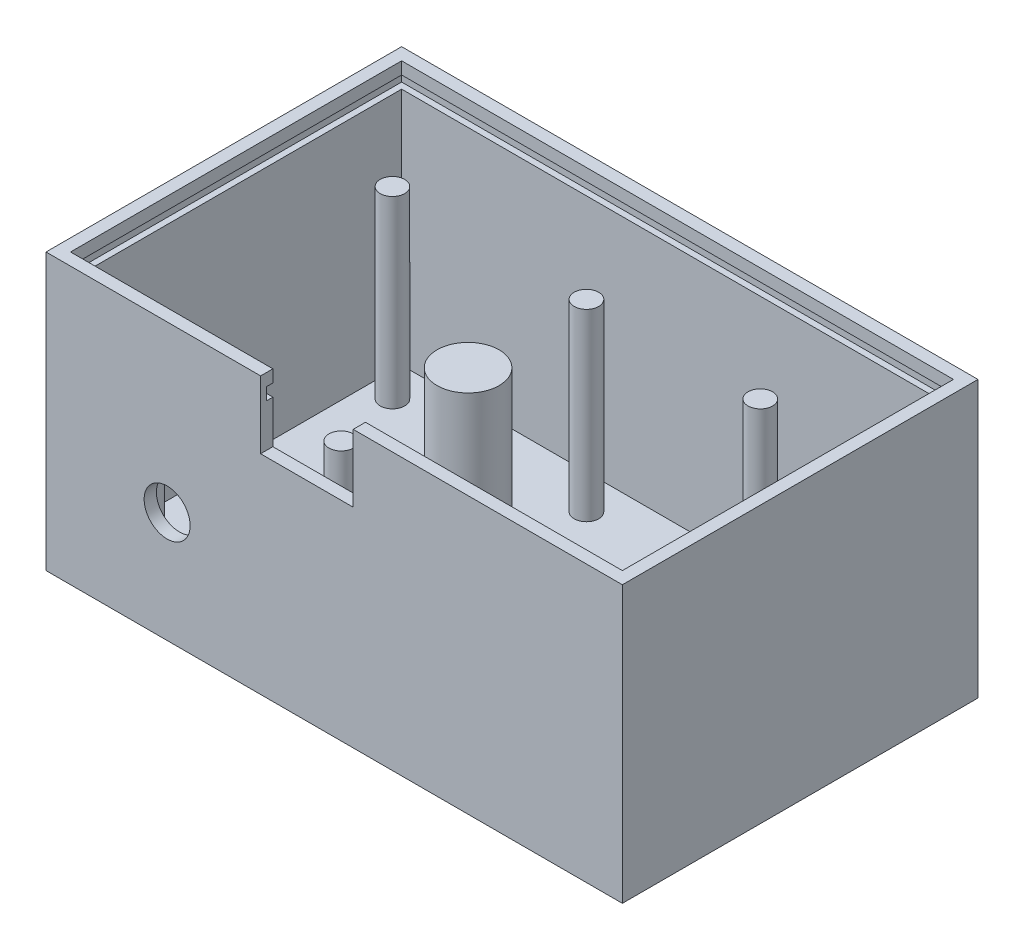
ISO-10303-21;
HEADER;
FILE_DESCRIPTION(('STEP AP214'),'2;1');
FILE_NAME('part.step','',(''),(''),'','','');
FILE_SCHEMA(('AUTOMOTIVE_DESIGN { 1 0 10303 214 1 1 1 1 }'));
ENDSEC;
DATA;
#1=APPLICATION_CONTEXT('core data for automotive mechanical design processes');
#2=APPLICATION_PROTOCOL_DEFINITION('international standard','automotive_design',2000,#1);
#3=PRODUCT_CONTEXT('',#1,'mechanical');
#4=PRODUCT('Part','Part','',(#3));
#5=PRODUCT_RELATED_PRODUCT_CATEGORY('part','',(#4));
#6=PRODUCT_DEFINITION_FORMATION('','',#4);
#7=PRODUCT_DEFINITION_CONTEXT('part definition',#1,'design');
#8=PRODUCT_DEFINITION('design','',#6,#7);
#9=PRODUCT_DEFINITION_SHAPE('','',#8);
#10=(LENGTH_UNIT() NAMED_UNIT(*) SI_UNIT(.MILLI.,.METRE.));
#11=(NAMED_UNIT(*) PLANE_ANGLE_UNIT() SI_UNIT($,.RADIAN.));
#12=(NAMED_UNIT(*) SI_UNIT($,.STERADIAN.) SOLID_ANGLE_UNIT());
#13=UNCERTAINTY_MEASURE_WITH_UNIT(LENGTH_MEASURE(1.E-05),#10,'distance_accuracy_value','');
#14=(GEOMETRIC_REPRESENTATION_CONTEXT(3) GLOBAL_UNCERTAINTY_ASSIGNED_CONTEXT((#13)) GLOBAL_UNIT_ASSIGNED_CONTEXT((#10,
#11,#12)) REPRESENTATION_CONTEXT('',''));
#15=CARTESIAN_POINT('',(0.,0.,0.));
#16=DIRECTION('',(0.,0.,1.));
#17=DIRECTION('',(1.,0.,0.));
#18=AXIS2_PLACEMENT_3D('',#15,#16,#17);
#19=CARTESIAN_POINT('',(2.,2.,-2.00000000000001));
#20=DIRECTION('',(0.,0.,1.));
#21=DIRECTION('',(1.,0.,0.));
#22=AXIS2_PLACEMENT_3D('',#19,#20,#21);
#23=PLANE('',#22);
#24=DIRECTION('',(1.,0.,0.));
#25=VECTOR('',#24,1.);
#26=CARTESIAN_POINT('',(2.,45.,-2.00000000000001));
#27=LINE('',#26,#25);
#28=CARTESIAN_POINT('',(2.,45.,-2.00000000000001));
#29=VERTEX_POINT('',#28);
#30=CARTESIAN_POINT('',(35.,45.,-2.00000000000002));
#31=VERTEX_POINT('',#30);
#32=EDGE_CURVE('E343',#29,#31,#27,.T.);
#33=ORIENTED_EDGE('',*,*,#32,.T.);
#34=DIRECTION('',(0.,1.,0.));
#35=VECTOR('',#34,1.);
#36=CARTESIAN_POINT('',(35.,34.,-2.00000000000002));
#37=LINE('',#36,#35);
#38=CARTESIAN_POINT('',(35.,43.,-2.00000000000002));
#39=VERTEX_POINT('',#38);
#40=EDGE_CURVE('E226',#39,#31,#37,.T.);
#41=ORIENTED_EDGE('',*,*,#40,.F.);
#42=DIRECTION('',(1.,0.,0.));
#43=VECTOR('',#42,1.);
#44=CARTESIAN_POINT('',(2.,43.,-2.00000000000001));
#45=LINE('',#44,#43);
#46=CARTESIAN_POINT('',(2.,43.,-2.00000000000001));
#47=VERTEX_POINT('',#46);
#48=EDGE_CURVE('E307',#47,#39,#45,.T.);
#49=ORIENTED_EDGE('',*,*,#48,.F.);
#50=DIRECTION('',(0.,1.,0.));
#51=VECTOR('',#50,1.);
#52=CARTESIAN_POINT('',(2.,2.,-2.00000000000001));
#53=LINE('',#52,#51);
#54=EDGE_CURVE('E351',#47,#29,#53,.T.);
#55=ORIENTED_EDGE('',*,*,#54,.T.);
#56=EDGE_LOOP('',(#33,#41,#49,#55));
#57=FACE_BOUND('',#56,.T.);
#58=ADVANCED_FACE('F35',(#57),#23,.F.);
#59=CARTESIAN_POINT('',(93.,41.,-1.));
#60=DIRECTION('',(0.,0.,-1.));
#61=DIRECTION('',(-1.,0.,0.));
#62=AXIS2_PLACEMENT_3D('',#59,#60,#61);
#63=PLANE('',#62);
#64=DIRECTION('',(0.,1.,0.));
#65=VECTOR('',#64,1.);
#66=CARTESIAN_POINT('',(35.,41.,-1.));
#67=LINE('',#66,#65);
#68=CARTESIAN_POINT('',(35.,41.,-1.));
#69=VERTEX_POINT('',#68);
#70=CARTESIAN_POINT('',(35.,43.,-1.));
#71=VERTEX_POINT('',#70);
#72=EDGE_CURVE('E240',#69,#71,#67,.T.);
#73=ORIENTED_EDGE('',*,*,#72,.F.);
#74=DIRECTION('',(-1.,0.,0.));
#75=VECTOR('',#74,1.);
#76=CARTESIAN_POINT('',(93.,41.,-1.));
#77=LINE('',#76,#75);
#78=CARTESIAN_POINT('',(1.,41.,-1.));
#79=VERTEX_POINT('',#78);
#80=EDGE_CURVE('E276',#69,#79,#77,.T.);
#81=ORIENTED_EDGE('',*,*,#80,.T.);
#82=DIRECTION('',(0.,1.,0.));
#83=VECTOR('',#82,1.);
#84=CARTESIAN_POINT('',(1.,41.,-1.));
#85=LINE('',#84,#83);
#86=CARTESIAN_POINT('',(1.,43.,-1.));
#87=VERTEX_POINT('',#86);
#88=EDGE_CURVE('E300',#79,#87,#85,.T.);
#89=ORIENTED_EDGE('',*,*,#88,.T.);
#90=DIRECTION('',(-1.,0.,0.));
#91=VECTOR('',#90,1.);
#92=CARTESIAN_POINT('',(93.,43.,-1.));
#93=LINE('',#92,#91);
#94=EDGE_CURVE('E288',#71,#87,#93,.T.);
#95=ORIENTED_EDGE('',*,*,#94,.F.);
#96=EDGE_LOOP('',(#73,#81,#89,#95));
#97=FACE_BOUND('',#96,.T.);
#98=ADVANCED_FACE('F422',(#97),#63,.T.);
#99=CARTESIAN_POINT('',(0.,2.,0.));
#100=DIRECTION('',(0.,-1.,0.));
#101=DIRECTION('',(0.,0.,-1.));
#102=AXIS2_PLACEMENT_3D('',#99,#100,#101);
#103=PLANE('',#102);
#104=CARTESIAN_POINT('',(37.7618296494176,2.,-10.3789579891175));
#105=DIRECTION('',(0.,-1.,0.));
#106=DIRECTION('',(0.,0.,-1.));
#107=AXIS2_PLACEMENT_3D('',#104,#105,#106);
#108=CIRCLE('',#107,2.);
#109=CARTESIAN_POINT('',(37.7618296494176,2.,-12.3789579891175));
#110=VERTEX_POINT('',#109);
#111=EDGE_CURVE('E43',#110,#110,#108,.F.);
#112=ORIENTED_EDGE('',*,*,#111,.F.);
#113=EDGE_LOOP('',(#112));
#114=FACE_BOUND('',#113,.T.);
#115=CARTESIAN_POINT('',(6.,2.,-10.5));
#116=DIRECTION('',(0.,-1.,0.));
#117=DIRECTION('',(0.,0.,-1.));
#118=AXIS2_PLACEMENT_3D('',#115,#116,#117);
#119=CIRCLE('',#118,2.);
#120=CARTESIAN_POINT('',(6.,2.,-12.5));
#121=VERTEX_POINT('',#120);
#122=EDGE_CURVE('E408',#121,#121,#119,.F.);
#123=ORIENTED_EDGE('',*,*,#122,.F.);
#124=EDGE_LOOP('',(#123));
#125=FACE_BOUND('',#124,.T.);
#126=CARTESIAN_POINT('',(6.,2.,-50.5));
#127=DIRECTION('',(0.,-1.,0.));
#128=DIRECTION('',(0.,0.,-1.));
#129=AXIS2_PLACEMENT_3D('',#126,#127,#128);
#130=CIRCLE('',#129,2.);
#131=CARTESIAN_POINT('',(6.,2.,-52.5));
#132=VERTEX_POINT('',#131);
#133=EDGE_CURVE('E402',#132,#132,#130,.F.);
#134=ORIENTED_EDGE('',*,*,#133,.F.);
#135=EDGE_LOOP('',(#134));
#136=FACE_BOUND('',#135,.T.);
#137=DIRECTION('',(1.,0.,0.));
#138=VECTOR('',#137,1.);
#139=CARTESIAN_POINT('',(2.,2.,-56.));
#140=LINE('',#139,#138);
#141=CARTESIAN_POINT('',(2.,2.,-56.));
#142=VERTEX_POINT('',#141);
#143=CARTESIAN_POINT('',(92.,2.,-56.));
#144=VERTEX_POINT('',#143);
#145=EDGE_CURVE('E324',#142,#144,#140,.T.);
#146=ORIENTED_EDGE('',*,*,#145,.F.);
#147=DIRECTION('',(0.,0.,1.));
#148=VECTOR('',#147,1.);
#149=CARTESIAN_POINT('',(2.,2.,-56.));
#150=LINE('',#149,#148);
#151=CARTESIAN_POINT('',(2.,2.,-2.00000000000001));
#152=VERTEX_POINT('',#151);
#153=EDGE_CURVE('E333',#142,#152,#150,.T.);
#154=ORIENTED_EDGE('',*,*,#153,.T.);
#155=DIRECTION('',(1.,0.,0.));
#156=VECTOR('',#155,1.);
#157=CARTESIAN_POINT('',(2.,2.,-2.00000000000001));
#158=LINE('',#157,#156);
#159=CARTESIAN_POINT('',(92.,2.,-2.00000000000001));
#160=VERTEX_POINT('',#159);
#161=EDGE_CURVE('E330',#152,#160,#158,.T.);
#162=ORIENTED_EDGE('',*,*,#161,.T.);
#163=DIRECTION('',(0.,0.,1.));
#164=VECTOR('',#163,1.);
#165=CARTESIAN_POINT('',(92.,2.,-56.));
#166=LINE('',#165,#164);
#167=EDGE_CURVE('E327',#144,#160,#166,.T.);
#168=ORIENTED_EDGE('',*,*,#167,.F.);
#169=EDGE_LOOP('',(#146,#154,#162,#168));
#170=FACE_BOUND('',#169,.T.);
#171=CARTESIAN_POINT('',(37.7618296494176,2.,-50.3789579891175));
#172=DIRECTION('',(0.,-1.,0.));
#173=DIRECTION('',(0.,0.,-1.));
#174=AXIS2_PLACEMENT_3D('',#171,#172,#173);
#175=CIRCLE('',#174,2.);
#176=CARTESIAN_POINT('',(37.7618296494176,2.,-52.3789579891175));
#177=VERTEX_POINT('',#176);
#178=EDGE_CURVE('E399',#177,#177,#175,.F.);
#179=ORIENTED_EDGE('',*,*,#178,.F.);
#180=EDGE_LOOP('',(#179));
#181=FACE_BOUND('',#180,.T.);
#182=CARTESIAN_POINT('',(66.,2.,-50.5));
#183=DIRECTION('',(0.,-1.,0.));
#184=DIRECTION('',(0.,0.,-1.));
#185=AXIS2_PLACEMENT_3D('',#182,#183,#184);
#186=CIRCLE('',#185,2.);
#187=CARTESIAN_POINT('',(66.,2.,-52.5));
#188=VERTEX_POINT('',#187);
#189=EDGE_CURVE('E405',#188,#188,#186,.F.);
#190=ORIENTED_EDGE('',*,*,#189,.F.);
#191=EDGE_LOOP('',(#190));
#192=FACE_BOUND('',#191,.T.);
#193=CARTESIAN_POINT('',(66.,2.,-10.5));
#194=DIRECTION('',(0.,-1.,0.));
#195=DIRECTION('',(0.,0.,-1.));
#196=AXIS2_PLACEMENT_3D('',#193,#194,#195);
#197=CIRCLE('',#196,2.);
#198=CARTESIAN_POINT('',(66.,2.,-12.5));
#199=VERTEX_POINT('',#198);
#200=EDGE_CURVE('E411',#199,#199,#197,.F.);
#201=ORIENTED_EDGE('',*,*,#200,.F.);
#202=EDGE_LOOP('',(#201));
#203=FACE_BOUND('',#202,.T.);
#204=CARTESIAN_POINT('',(37.7618296494176,2.,-31.0735729181821));
#205=DIRECTION('',(0.,-1.,0.));
#206=DIRECTION('',(0.,0.,-1.));
#207=AXIS2_PLACEMENT_3D('',#204,#205,#206);
#208=CIRCLE('',#207,5.05605768649716);
#209=CARTESIAN_POINT('',(37.7618296494176,2.,-36.1296306046793));
#210=VERTEX_POINT('',#209);
#211=EDGE_CURVE('E11',#210,#210,#208,.F.);
#212=ORIENTED_EDGE('',*,*,#211,.F.);
#213=EDGE_LOOP('',(#212));
#214=FACE_BOUND('',#213,.T.);
#215=ADVANCED_FACE('F418',(#114,#125,#136,#170,#181,#192,#203,#214),#103,.F.);
#216=CARTESIAN_POINT('',(2.,2.,-56.));
#217=DIRECTION('',(0.,0.,1.));
#218=DIRECTION('',(1.,0.,0.));
#219=AXIS2_PLACEMENT_3D('',#216,#217,#218);
#220=PLANE('',#219);
#221=DIRECTION('',(0.,1.,0.));
#222=VECTOR('',#221,1.);
#223=CARTESIAN_POINT('',(2.,2.,-56.));
#224=LINE('',#223,#222);
#225=CARTESIAN_POINT('',(2.,43.,-56.));
#226=VERTEX_POINT('',#225);
#227=CARTESIAN_POINT('',(2.,45.,-56.));
#228=VERTEX_POINT('',#227);
#229=EDGE_CURVE('E336',#226,#228,#224,.T.);
#230=ORIENTED_EDGE('',*,*,#229,.F.);
#231=DIRECTION('',(1.,0.,0.));
#232=VECTOR('',#231,1.);
#233=CARTESIAN_POINT('',(2.,43.,-56.));
#234=LINE('',#233,#232);
#235=CARTESIAN_POINT('',(92.,43.,-56.));
#236=VERTEX_POINT('',#235);
#237=EDGE_CURVE('E58',#226,#236,#234,.T.);
#238=ORIENTED_EDGE('',*,*,#237,.T.);
#239=DIRECTION('',(0.,1.,0.));
#240=VECTOR('',#239,1.);
#241=CARTESIAN_POINT('',(92.,2.,-56.));
#242=LINE('',#241,#240);
#243=CARTESIAN_POINT('',(92.,45.,-56.));
#244=VERTEX_POINT('',#243);
#245=EDGE_CURVE('E359',#236,#244,#242,.T.);
#246=ORIENTED_EDGE('',*,*,#245,.T.);
#247=DIRECTION('',(1.,0.,0.));
#248=VECTOR('',#247,1.);
#249=CARTESIAN_POINT('',(2.,45.,-56.));
#250=LINE('',#249,#248);
#251=EDGE_CURVE('E323',#228,#244,#250,.T.);
#252=ORIENTED_EDGE('',*,*,#251,.F.);
#253=EDGE_LOOP('',(#230,#238,#246,#252));
#254=FACE_BOUND('',#253,.T.);
#255=ADVANCED_FACE('F421',(#254),#220,.T.);
#256=CARTESIAN_POINT('',(92.,2.,-56.));
#257=DIRECTION('',(-1.,0.,0.));
#258=DIRECTION('',(0.,0.,1.));
#259=AXIS2_PLACEMENT_3D('',#256,#257,#258);
#260=PLANE('',#259);
#261=ORIENTED_EDGE('',*,*,#245,.F.);
#262=DIRECTION('',(0.,0.,1.));
#263=VECTOR('',#262,1.);
#264=CARTESIAN_POINT('',(92.,43.,-56.));
#265=LINE('',#264,#263);
#266=CARTESIAN_POINT('',(92.,43.,-2.00000000000001));
#267=VERTEX_POINT('',#266);
#268=EDGE_CURVE('E310',#236,#267,#265,.T.);
#269=ORIENTED_EDGE('',*,*,#268,.T.);
#270=DIRECTION('',(0.,1.,0.));
#271=VECTOR('',#270,1.);
#272=CARTESIAN_POINT('',(92.,2.,-2.00000000000001));
#273=LINE('',#272,#271);
#274=CARTESIAN_POINT('',(92.,45.,-2.00000000000001));
#275=VERTEX_POINT('',#274);
#276=EDGE_CURVE('E355',#267,#275,#273,.T.);
#277=ORIENTED_EDGE('',*,*,#276,.T.);
#278=DIRECTION('',(0.,0.,1.));
#279=VECTOR('',#278,1.);
#280=CARTESIAN_POINT('',(92.,45.,-56.));
#281=LINE('',#280,#279);
#282=EDGE_CURVE('E339',#244,#275,#281,.T.);
#283=ORIENTED_EDGE('',*,*,#282,.F.);
#284=EDGE_LOOP('',(#261,#269,#277,#283));
#285=FACE_BOUND('',#284,.T.);
#286=ADVANCED_FACE('F470',(#285),#260,.T.);
#287=CARTESIAN_POINT('',(50.1,43.,-2.00000000000002));
#288=VERTEX_POINT('',#287);
#289=EDGE_CURVE('E306',#288,#267,#45,.T.);
#290=ORIENTED_EDGE('',*,*,#289,.F.);
#291=DIRECTION('',(0.,1.,0.));
#292=VECTOR('',#291,1.);
#293=CARTESIAN_POINT('',(50.1,34.,-2.00000000000002));
#294=LINE('',#293,#292);
#295=CARTESIAN_POINT('',(50.1,45.,-2.00000000000002));
#296=VERTEX_POINT('',#295);
#297=EDGE_CURVE('E230',#288,#296,#294,.T.);
#298=ORIENTED_EDGE('',*,*,#297,.T.);
#299=EDGE_CURVE('E342',#296,#275,#27,.T.);
#300=ORIENTED_EDGE('',*,*,#299,.T.);
#301=ORIENTED_EDGE('',*,*,#276,.F.);
#302=EDGE_LOOP('',(#290,#298,#300,#301));
#303=FACE_BOUND('',#302,.T.);
#304=ADVANCED_FACE('F458',(#303),#23,.F.);
#305=CARTESIAN_POINT('',(2.,2.,-56.));
#306=DIRECTION('',(-1.,0.,0.));
#307=DIRECTION('',(0.,0.,1.));
#308=AXIS2_PLACEMENT_3D('',#305,#306,#307);
#309=PLANE('',#308);
#310=DIRECTION('',(0.,0.,1.));
#311=VECTOR('',#310,1.);
#312=CARTESIAN_POINT('',(2.,43.,-56.));
#313=LINE('',#312,#311);
#314=EDGE_CURVE('E394',#226,#47,#313,.T.);
#315=ORIENTED_EDGE('',*,*,#314,.F.);
#316=ORIENTED_EDGE('',*,*,#229,.T.);
#317=DIRECTION('',(0.,0.,1.));
#318=VECTOR('',#317,1.);
#319=CARTESIAN_POINT('',(2.,45.,-56.));
#320=LINE('',#319,#318);
#321=EDGE_CURVE('E328',#228,#29,#320,.T.);
#322=ORIENTED_EDGE('',*,*,#321,.T.);
#323=ORIENTED_EDGE('',*,*,#54,.F.);
#324=EDGE_LOOP('',(#315,#316,#322,#323));
#325=FACE_BOUND('',#324,.T.);
#326=ADVANCED_FACE('F469',(#325),#309,.F.);
#327=CARTESIAN_POINT('',(0.,45.,0.));
#328=DIRECTION('',(0.,-1.,0.));
#329=DIRECTION('',(0.,0.,-1.));
#330=AXIS2_PLACEMENT_3D('',#327,#328,#329);
#331=PLANE('',#330);
#332=DIRECTION('',(1.,0.,0.));
#333=VECTOR('',#332,1.);
#334=CARTESIAN_POINT('',(0.,45.,0.));
#335=LINE('',#334,#333);
#336=CARTESIAN_POINT('',(0.,45.,0.));
#337=VERTEX_POINT('',#336);
#338=CARTESIAN_POINT('',(35.,45.,0.));
#339=VERTEX_POINT('',#338);
#340=EDGE_CURVE('E369',#337,#339,#335,.T.);
#341=ORIENTED_EDGE('',*,*,#340,.T.);
#342=DIRECTION('',(0.,0.,1.));
#343=VECTOR('',#342,1.);
#344=CARTESIAN_POINT('',(35.,45.,-2.00000000000002));
#345=LINE('',#344,#343);
#346=EDGE_CURVE('E201',#31,#339,#345,.T.);
#347=ORIENTED_EDGE('',*,*,#346,.F.);
#348=ORIENTED_EDGE('',*,*,#32,.F.);
#349=ORIENTED_EDGE('',*,*,#321,.F.);
#350=ORIENTED_EDGE('',*,*,#251,.T.);
#351=ORIENTED_EDGE('',*,*,#282,.T.);
#352=ORIENTED_EDGE('',*,*,#299,.F.);
#353=DIRECTION('',(0.,0.,-1.));
#354=VECTOR('',#353,1.);
#355=CARTESIAN_POINT('',(50.1,45.,-2.00000000000002));
#356=LINE('',#355,#354);
#357=CARTESIAN_POINT('',(50.1,45.,0.));
#358=VERTEX_POINT('',#357);
#359=EDGE_CURVE('E213',#358,#296,#356,.T.);
#360=ORIENTED_EDGE('',*,*,#359,.F.);
#361=CARTESIAN_POINT('',(94.,45.,0.));
#362=VERTEX_POINT('',#361);
#363=EDGE_CURVE('E367',#358,#362,#335,.T.);
#364=ORIENTED_EDGE('',*,*,#363,.T.);
#365=DIRECTION('',(0.,0.,-1.));
#366=VECTOR('',#365,1.);
#367=CARTESIAN_POINT('',(94.,45.,0.));
#368=LINE('',#367,#366);
#369=CARTESIAN_POINT('',(94.,45.,-58.));
#370=VERTEX_POINT('',#369);
#371=EDGE_CURVE('E371',#362,#370,#368,.T.);
#372=ORIENTED_EDGE('',*,*,#371,.T.);
#373=DIRECTION('',(-1.,0.,0.));
#374=VECTOR('',#373,1.);
#375=CARTESIAN_POINT('',(0.,45.,-58.));
#376=LINE('',#375,#374);
#377=CARTESIAN_POINT('',(0.,45.,-58.));
#378=VERTEX_POINT('',#377);
#379=EDGE_CURVE('E373',#370,#378,#376,.T.);
#380=ORIENTED_EDGE('',*,*,#379,.T.);
#381=DIRECTION('',(0.,0.,1.));
#382=VECTOR('',#381,1.);
#383=CARTESIAN_POINT('',(0.,45.,0.));
#384=LINE('',#383,#382);
#385=EDGE_CURVE('E364',#378,#337,#384,.T.);
#386=ORIENTED_EDGE('',*,*,#385,.T.);
#387=EDGE_LOOP('',(#341,#347,#348,#349,#350,#351,#352,#360,#364,#372,#380,#386));
#388=FACE_BOUND('',#387,.T.);
#389=ADVANCED_FACE('F501',(#388),#331,.F.);
#390=CARTESIAN_POINT('',(0.,45.,0.));
#391=DIRECTION('',(1.,0.,0.));
#392=DIRECTION('',(0.,0.,-1.));
#393=AXIS2_PLACEMENT_3D('',#390,#391,#392);
#394=PLANE('',#393);
#395=DIRECTION('',(0.,0.,1.));
#396=VECTOR('',#395,1.);
#397=CARTESIAN_POINT('',(0.,0.,0.));
#398=LINE('',#397,#396);
#399=CARTESIAN_POINT('',(0.,0.,-58.));
#400=VERTEX_POINT('',#399);
#401=CARTESIAN_POINT('',(0.,0.,0.));
#402=VERTEX_POINT('',#401);
#403=EDGE_CURVE('E363',#400,#402,#398,.T.);
#404=ORIENTED_EDGE('',*,*,#403,.T.);
#405=DIRECTION('',(0.,-1.,0.));
#406=VECTOR('',#405,1.);
#407=CARTESIAN_POINT('',(0.,45.,0.));
#408=LINE('',#407,#406);
#409=EDGE_CURVE('E391',#337,#402,#408,.T.);
#410=ORIENTED_EDGE('',*,*,#409,.F.);
#411=ORIENTED_EDGE('',*,*,#385,.F.);
#412=DIRECTION('',(0.,-1.,0.));
#413=VECTOR('',#412,1.);
#414=CARTESIAN_POINT('',(0.,45.,-58.));
#415=LINE('',#414,#413);
#416=EDGE_CURVE('E375',#378,#400,#415,.T.);
#417=ORIENTED_EDGE('',*,*,#416,.T.);
#418=EDGE_LOOP('',(#404,#410,#411,#417));
#419=FACE_BOUND('',#418,.T.);
#420=ADVANCED_FACE('F37',(#419),#394,.F.);
#421=CARTESIAN_POINT('',(0.,45.,0.));
#422=DIRECTION('',(0.,0.,-1.));
#423=DIRECTION('',(-1.,0.,0.));
#424=AXIS2_PLACEMENT_3D('',#421,#422,#423);
#425=PLANE('',#424);
#426=CARTESIAN_POINT('',(19.7551583671536,18.0837308699993,0.));
#427=DIRECTION('',(0.,0.,1.));
#428=DIRECTION('',(1.,0.,0.));
#429=AXIS2_PLACEMENT_3D('',#426,#427,#428);
#430=CIRCLE('',#429,3.75);
#431=CARTESIAN_POINT('',(23.5051583671536,18.0837308699993,0.));
#432=VERTEX_POINT('',#431);
#433=EDGE_CURVE('E245',#432,#432,#430,.T.);
#434=ORIENTED_EDGE('',*,*,#433,.F.);
#435=EDGE_LOOP('',(#434));
#436=FACE_BOUND('',#435,.T.);
#437=DIRECTION('',(1.,0.,0.));
#438=VECTOR('',#437,1.);
#439=CARTESIAN_POINT('',(35.,34.,0.));
#440=LINE('',#439,#438);
#441=CARTESIAN_POINT('',(35.,34.,0.));
#442=VERTEX_POINT('',#441);
#443=CARTESIAN_POINT('',(50.1,34.,0.));
#444=VERTEX_POINT('',#443);
#445=EDGE_CURVE('E209',#442,#444,#440,.T.);
#446=ORIENTED_EDGE('',*,*,#445,.F.);
#447=DIRECTION('',(0.,1.,0.));
#448=VECTOR('',#447,1.);
#449=CARTESIAN_POINT('',(35.,34.,0.));
#450=LINE('',#449,#448);
#451=EDGE_CURVE('E196',#442,#339,#450,.T.);
#452=ORIENTED_EDGE('',*,*,#451,.T.);
#453=ORIENTED_EDGE('',*,*,#340,.F.);
#454=ORIENTED_EDGE('',*,*,#409,.T.);
#455=DIRECTION('',(1.,0.,0.));
#456=VECTOR('',#455,1.);
#457=CARTESIAN_POINT('',(0.,0.,0.));
#458=LINE('',#457,#456);
#459=CARTESIAN_POINT('',(94.,0.,0.));
#460=VERTEX_POINT('',#459);
#461=EDGE_CURVE('E378',#402,#460,#458,.T.);
#462=ORIENTED_EDGE('',*,*,#461,.T.);
#463=DIRECTION('',(0.,-1.,0.));
#464=VECTOR('',#463,1.);
#465=CARTESIAN_POINT('',(94.,45.,0.));
#466=LINE('',#465,#464);
#467=EDGE_CURVE('E388',#362,#460,#466,.T.);
#468=ORIENTED_EDGE('',*,*,#467,.F.);
#469=ORIENTED_EDGE('',*,*,#363,.F.);
#470=DIRECTION('',(0.,1.,0.));
#471=VECTOR('',#470,1.);
#472=CARTESIAN_POINT('',(50.1,34.,0.));
#473=LINE('',#472,#471);
#474=EDGE_CURVE('E205',#444,#358,#473,.T.);
#475=ORIENTED_EDGE('',*,*,#474,.F.);
#476=EDGE_LOOP('',(#446,#452,#453,#454,#462,#468,#469,#475));
#477=FACE_BOUND('',#476,.T.);
#478=ADVANCED_FACE('F215',(#436,#477),#425,.F.);
#479=CARTESIAN_POINT('',(94.,45.,0.));
#480=DIRECTION('',(-1.,0.,0.));
#481=DIRECTION('',(0.,0.,1.));
#482=AXIS2_PLACEMENT_3D('',#479,#480,#481);
#483=PLANE('',#482);
#484=DIRECTION('',(0.,0.,-1.));
#485=VECTOR('',#484,1.);
#486=CARTESIAN_POINT('',(94.,0.,0.));
#487=LINE('',#486,#485);
#488=CARTESIAN_POINT('',(94.,0.,-58.));
#489=VERTEX_POINT('',#488);
#490=EDGE_CURVE('E380',#460,#489,#487,.T.);
#491=ORIENTED_EDGE('',*,*,#490,.T.);
#492=DIRECTION('',(0.,-1.,0.));
#493=VECTOR('',#492,1.);
#494=CARTESIAN_POINT('',(94.,45.,-58.));
#495=LINE('',#494,#493);
#496=EDGE_CURVE('E385',#370,#489,#495,.T.);
#497=ORIENTED_EDGE('',*,*,#496,.F.);
#498=ORIENTED_EDGE('',*,*,#371,.F.);
#499=ORIENTED_EDGE('',*,*,#467,.T.);
#500=EDGE_LOOP('',(#491,#497,#498,#499));
#501=FACE_BOUND('',#500,.T.);
#502=ADVANCED_FACE('F493',(#501),#483,.F.);
#503=CARTESIAN_POINT('',(0.,45.,-58.));
#504=DIRECTION('',(0.,0.,1.));
#505=DIRECTION('',(1.,0.,0.));
#506=AXIS2_PLACEMENT_3D('',#503,#504,#505);
#507=PLANE('',#506);
#508=DIRECTION('',(-1.,0.,0.));
#509=VECTOR('',#508,1.);
#510=CARTESIAN_POINT('',(0.,0.,-58.));
#511=LINE('',#510,#509);
#512=EDGE_CURVE('E368',#489,#400,#511,.T.);
#513=ORIENTED_EDGE('',*,*,#512,.T.);
#514=ORIENTED_EDGE('',*,*,#416,.F.);
#515=ORIENTED_EDGE('',*,*,#379,.F.);
#516=ORIENTED_EDGE('',*,*,#496,.T.);
#517=EDGE_LOOP('',(#513,#514,#515,#516));
#518=FACE_BOUND('',#517,.T.);
#519=ADVANCED_FACE('F498',(#518),#507,.F.);
#520=CARTESIAN_POINT('',(0.,0.,0.));
#521=DIRECTION('',(0.,-1.,0.));
#522=DIRECTION('',(0.,0.,-1.));
#523=AXIS2_PLACEMENT_3D('',#520,#521,#522);
#524=PLANE('',#523);
#525=ORIENTED_EDGE('',*,*,#403,.F.);
#526=ORIENTED_EDGE('',*,*,#512,.F.);
#527=ORIENTED_EDGE('',*,*,#490,.F.);
#528=ORIENTED_EDGE('',*,*,#461,.F.);
#529=EDGE_LOOP('',(#525,#526,#527,#528));
#530=FACE_BOUND('',#529,.T.);
#531=ADVANCED_FACE('F506',(#530),#524,.T.);
#532=CARTESIAN_POINT('',(93.,41.,-57.));
#533=DIRECTION('',(-1.,0.,0.));
#534=DIRECTION('',(0.,0.,1.));
#535=AXIS2_PLACEMENT_3D('',#532,#533,#534);
#536=PLANE('',#535);
#537=DIRECTION('',(0.,0.,1.));
#538=VECTOR('',#537,1.);
#539=CARTESIAN_POINT('',(93.,43.,-57.));
#540=LINE('',#539,#538);
#541=CARTESIAN_POINT('',(93.,43.,-57.));
#542=VERTEX_POINT('',#541);
#543=CARTESIAN_POINT('',(93.,43.,-1.));
#544=VERTEX_POINT('',#543);
#545=EDGE_CURVE('E272',#542,#544,#540,.T.);
#546=ORIENTED_EDGE('',*,*,#545,.F.);
#547=DIRECTION('',(0.,1.,0.));
#548=VECTOR('',#547,1.);
#549=CARTESIAN_POINT('',(93.,41.,-57.));
#550=LINE('',#549,#548);
#551=CARTESIAN_POINT('',(93.,41.,-57.));
#552=VERTEX_POINT('',#551);
#553=EDGE_CURVE('E285',#552,#542,#550,.T.);
#554=ORIENTED_EDGE('',*,*,#553,.F.);
#555=DIRECTION('',(0.,0.,1.));
#556=VECTOR('',#555,1.);
#557=CARTESIAN_POINT('',(93.,41.,-57.));
#558=LINE('',#557,#556);
#559=CARTESIAN_POINT('',(93.,41.,-1.));
#560=VERTEX_POINT('',#559);
#561=EDGE_CURVE('E273',#552,#560,#558,.T.);
#562=ORIENTED_EDGE('',*,*,#561,.T.);
#563=DIRECTION('',(0.,1.,0.));
#564=VECTOR('',#563,1.);
#565=CARTESIAN_POINT('',(93.,41.,-1.));
#566=LINE('',#565,#564);
#567=EDGE_CURVE('E303',#560,#544,#566,.T.);
#568=ORIENTED_EDGE('',*,*,#567,.T.);
#569=EDGE_LOOP('',(#546,#554,#562,#568));
#570=FACE_BOUND('',#569,.T.);
#571=ADVANCED_FACE('F510',(#570),#536,.T.);
#572=DIRECTION('',(0.,-1.,0.));
#573=VECTOR('',#572,1.);
#574=CARTESIAN_POINT('',(50.1,41.,-1.));
#575=LINE('',#574,#573);
#576=CARTESIAN_POINT('',(50.1,43.,-1.));
#577=VERTEX_POINT('',#576);
#578=CARTESIAN_POINT('',(50.1,41.,-1.));
#579=VERTEX_POINT('',#578);
#580=EDGE_CURVE('E233',#577,#579,#575,.T.);
#581=ORIENTED_EDGE('',*,*,#580,.F.);
#582=EDGE_CURVE('E289',#544,#577,#93,.T.);
#583=ORIENTED_EDGE('',*,*,#582,.F.);
#584=ORIENTED_EDGE('',*,*,#567,.F.);
#585=EDGE_CURVE('E278',#560,#579,#77,.T.);
#586=ORIENTED_EDGE('',*,*,#585,.T.);
#587=EDGE_LOOP('',(#581,#583,#584,#586));
#588=FACE_BOUND('',#587,.T.);
#589=ADVANCED_FACE('F465',(#588),#63,.T.);
#590=CARTESIAN_POINT('',(1.,41.,-57.));
#591=DIRECTION('',(1.,0.,0.));
#592=DIRECTION('',(0.,0.,-1.));
#593=AXIS2_PLACEMENT_3D('',#590,#591,#592);
#594=PLANE('',#593);
#595=DIRECTION('',(0.,0.,-1.));
#596=VECTOR('',#595,1.);
#597=CARTESIAN_POINT('',(1.,43.,-57.));
#598=LINE('',#597,#596);
#599=CARTESIAN_POINT('',(1.,43.,-57.));
#600=VERTEX_POINT('',#599);
#601=EDGE_CURVE('E292',#87,#600,#598,.T.);
#602=ORIENTED_EDGE('',*,*,#601,.F.);
#603=ORIENTED_EDGE('',*,*,#88,.F.);
#604=DIRECTION('',(0.,0.,-1.));
#605=VECTOR('',#604,1.);
#606=CARTESIAN_POINT('',(1.,41.,-57.));
#607=LINE('',#606,#605);
#608=CARTESIAN_POINT('',(1.,41.,-57.));
#609=VERTEX_POINT('',#608);
#610=EDGE_CURVE('E281',#79,#609,#607,.T.);
#611=ORIENTED_EDGE('',*,*,#610,.T.);
#612=DIRECTION('',(0.,1.,0.));
#613=VECTOR('',#612,1.);
#614=CARTESIAN_POINT('',(1.,41.,-57.));
#615=LINE('',#614,#613);
#616=EDGE_CURVE('E297',#609,#600,#615,.T.);
#617=ORIENTED_EDGE('',*,*,#616,.T.);
#618=EDGE_LOOP('',(#602,#603,#611,#617));
#619=FACE_BOUND('',#618,.T.);
#620=ADVANCED_FACE('F581',(#619),#594,.T.);
#621=CARTESIAN_POINT('',(93.,41.,-57.));
#622=DIRECTION('',(0.,0.,1.));
#623=DIRECTION('',(1.,0.,0.));
#624=AXIS2_PLACEMENT_3D('',#621,#622,#623);
#625=PLANE('',#624);
#626=DIRECTION('',(1.,0.,0.));
#627=VECTOR('',#626,1.);
#628=CARTESIAN_POINT('',(93.,43.,-57.));
#629=LINE('',#628,#627);
#630=EDGE_CURVE('E277',#600,#542,#629,.T.);
#631=ORIENTED_EDGE('',*,*,#630,.F.);
#632=ORIENTED_EDGE('',*,*,#616,.F.);
#633=DIRECTION('',(1.,0.,0.));
#634=VECTOR('',#633,1.);
#635=CARTESIAN_POINT('',(93.,41.,-57.));
#636=LINE('',#635,#634);
#637=EDGE_CURVE('E283',#609,#552,#636,.T.);
#638=ORIENTED_EDGE('',*,*,#637,.T.);
#639=ORIENTED_EDGE('',*,*,#553,.T.);
#640=EDGE_LOOP('',(#631,#632,#638,#639));
#641=FACE_BOUND('',#640,.T.);
#642=ADVANCED_FACE('F575',(#641),#625,.T.);
#643=CARTESIAN_POINT('',(0.,41.,0.));
#644=DIRECTION('',(0.,-1.,0.));
#645=DIRECTION('',(0.,0.,-1.));
#646=AXIS2_PLACEMENT_3D('',#643,#644,#645);
#647=PLANE('',#646);
#648=ORIENTED_EDGE('',*,*,#80,.F.);
#649=DIRECTION('',(0.,0.,-1.));
#650=VECTOR('',#649,1.);
#651=CARTESIAN_POINT('',(35.,41.,0.));
#652=LINE('',#651,#650);
#653=CARTESIAN_POINT('',(35.,41.,-2.00000000000002));
#654=VERTEX_POINT('',#653);
#655=EDGE_CURVE('E242',#69,#654,#652,.T.);
#656=ORIENTED_EDGE('',*,*,#655,.T.);
#657=DIRECTION('',(1.,0.,0.));
#658=VECTOR('',#657,1.);
#659=CARTESIAN_POINT('',(2.,41.,-2.00000000000001));
#660=LINE('',#659,#658);
#661=CARTESIAN_POINT('',(2.,41.,-2.00000000000001));
#662=VERTEX_POINT('',#661);
#663=EDGE_CURVE('E315',#662,#654,#660,.T.);
#664=ORIENTED_EDGE('',*,*,#663,.F.);
#665=DIRECTION('',(0.,0.,1.));
#666=VECTOR('',#665,1.);
#667=CARTESIAN_POINT('',(2.,41.,-56.));
#668=LINE('',#667,#666);
#669=CARTESIAN_POINT('',(2.,41.,-56.));
#670=VERTEX_POINT('',#669);
#671=EDGE_CURVE('E396',#670,#662,#668,.T.);
#672=ORIENTED_EDGE('',*,*,#671,.F.);
#673=DIRECTION('',(1.,0.,0.));
#674=VECTOR('',#673,1.);
#675=CARTESIAN_POINT('',(2.,41.,-56.));
#676=LINE('',#675,#674);
#677=CARTESIAN_POINT('',(92.,41.,-56.));
#678=VERTEX_POINT('',#677);
#679=EDGE_CURVE('E321',#670,#678,#676,.T.);
#680=ORIENTED_EDGE('',*,*,#679,.T.);
#681=DIRECTION('',(0.,0.,1.));
#682=VECTOR('',#681,1.);
#683=CARTESIAN_POINT('',(92.,41.,-56.));
#684=LINE('',#683,#682);
#685=CARTESIAN_POINT('',(92.,41.,-2.00000000000001));
#686=VERTEX_POINT('',#685);
#687=EDGE_CURVE('E318',#678,#686,#684,.T.);
#688=ORIENTED_EDGE('',*,*,#687,.T.);
#689=CARTESIAN_POINT('',(50.1,41.,-2.00000000000002));
#690=VERTEX_POINT('',#689);
#691=EDGE_CURVE('E314',#690,#686,#660,.T.);
#692=ORIENTED_EDGE('',*,*,#691,.F.);
#693=DIRECTION('',(0.,0.,1.));
#694=VECTOR('',#693,1.);
#695=CARTESIAN_POINT('',(50.1,41.,0.));
#696=LINE('',#695,#694);
#697=EDGE_CURVE('E235',#690,#579,#696,.T.);
#698=ORIENTED_EDGE('',*,*,#697,.T.);
#699=ORIENTED_EDGE('',*,*,#585,.F.);
#700=ORIENTED_EDGE('',*,*,#561,.F.);
#701=ORIENTED_EDGE('',*,*,#637,.F.);
#702=ORIENTED_EDGE('',*,*,#610,.F.);
#703=EDGE_LOOP('',(#648,#656,#664,#672,#680,#688,#692,#698,#699,#700,#701,#702));
#704=FACE_BOUND('',#703,.T.);
#705=ADVANCED_FACE('F567',(#704),#647,.F.);
#706=CARTESIAN_POINT('',(0.,43.,0.));
#707=DIRECTION('',(0.,-1.,0.));
#708=DIRECTION('',(0.,0.,-1.));
#709=AXIS2_PLACEMENT_3D('',#706,#707,#708);
#710=PLANE('',#709);
#711=DIRECTION('',(0.,0.,-1.));
#712=VECTOR('',#711,1.);
#713=CARTESIAN_POINT('',(35.,43.,0.));
#714=LINE('',#713,#712);
#715=EDGE_CURVE('E238',#71,#39,#714,.T.);
#716=ORIENTED_EDGE('',*,*,#715,.F.);
#717=ORIENTED_EDGE('',*,*,#94,.T.);
#718=ORIENTED_EDGE('',*,*,#601,.T.);
#719=ORIENTED_EDGE('',*,*,#630,.T.);
#720=ORIENTED_EDGE('',*,*,#545,.T.);
#721=ORIENTED_EDGE('',*,*,#582,.T.);
#722=DIRECTION('',(0.,0.,1.));
#723=VECTOR('',#722,1.);
#724=CARTESIAN_POINT('',(50.1,43.,0.));
#725=LINE('',#724,#723);
#726=EDGE_CURVE('E225',#288,#577,#725,.T.);
#727=ORIENTED_EDGE('',*,*,#726,.F.);
#728=ORIENTED_EDGE('',*,*,#289,.T.);
#729=ORIENTED_EDGE('',*,*,#268,.F.);
#730=ORIENTED_EDGE('',*,*,#237,.F.);
#731=ORIENTED_EDGE('',*,*,#314,.T.);
#732=ORIENTED_EDGE('',*,*,#48,.T.);
#733=EDGE_LOOP('',(#716,#717,#718,#719,#720,#721,#727,#728,#729,#730,#731,#732));
#734=FACE_BOUND('',#733,.T.);
#735=ADVANCED_FACE('F482',(#734),#710,.T.);
#736=EDGE_CURVE('E348',#142,#670,#224,.T.);
#737=ORIENTED_EDGE('',*,*,#736,.T.);
#738=ORIENTED_EDGE('',*,*,#671,.T.);
#739=EDGE_CURVE('E352',#152,#662,#53,.T.);
#740=ORIENTED_EDGE('',*,*,#739,.F.);
#741=ORIENTED_EDGE('',*,*,#153,.F.);
#742=EDGE_LOOP('',(#737,#738,#740,#741));
#743=FACE_BOUND('',#742,.T.);
#744=ADVANCED_FACE('F474',(#743),#309,.F.);
#745=ORIENTED_EDGE('',*,*,#663,.T.);
#746=CARTESIAN_POINT('',(35.,34.,-2.00000000000002));
#747=VERTEX_POINT('',#746);
#748=EDGE_CURVE('E223',#747,#654,#37,.T.);
#749=ORIENTED_EDGE('',*,*,#748,.F.);
#750=DIRECTION('',(-1.,0.,0.));
#751=VECTOR('',#750,1.);
#752=CARTESIAN_POINT('',(35.,34.,-2.00000000000002));
#753=LINE('',#752,#751);
#754=CARTESIAN_POINT('',(50.1,34.,-2.00000000000001));
#755=VERTEX_POINT('',#754);
#756=EDGE_CURVE('E206',#755,#747,#753,.T.);
#757=ORIENTED_EDGE('',*,*,#756,.F.);
#758=EDGE_CURVE('E227',#755,#690,#294,.T.);
#759=ORIENTED_EDGE('',*,*,#758,.T.);
#760=ORIENTED_EDGE('',*,*,#691,.T.);
#761=EDGE_CURVE('E356',#160,#686,#273,.T.);
#762=ORIENTED_EDGE('',*,*,#761,.F.);
#763=ORIENTED_EDGE('',*,*,#161,.F.);
#764=ORIENTED_EDGE('',*,*,#739,.T.);
#765=EDGE_LOOP('',(#745,#749,#757,#759,#760,#762,#763,#764));
#766=FACE_BOUND('',#765,.T.);
#767=CARTESIAN_POINT('',(19.7551583671536,18.0837308699993,-2.));
#768=DIRECTION('',(0.,0.,1.));
#769=DIRECTION('',(1.,0.,0.));
#770=AXIS2_PLACEMENT_3D('',#767,#768,#769);
#771=CIRCLE('',#770,3.75);
#772=CARTESIAN_POINT('',(23.5051583671536,18.0837308699993,-2.));
#773=VERTEX_POINT('',#772);
#774=EDGE_CURVE('E246',#773,#773,#771,.T.);
#775=ORIENTED_EDGE('',*,*,#774,.T.);
#776=EDGE_LOOP('',(#775));
#777=FACE_BOUND('',#776,.T.);
#778=ADVANCED_FACE('F459',(#766,#777),#23,.F.);
#779=ORIENTED_EDGE('',*,*,#687,.F.);
#780=EDGE_CURVE('E360',#144,#678,#242,.T.);
#781=ORIENTED_EDGE('',*,*,#780,.F.);
#782=ORIENTED_EDGE('',*,*,#167,.T.);
#783=ORIENTED_EDGE('',*,*,#761,.T.);
#784=EDGE_LOOP('',(#779,#781,#782,#783));
#785=FACE_BOUND('',#784,.T.);
#786=ADVANCED_FACE('F473',(#785),#260,.T.);
#787=ORIENTED_EDGE('',*,*,#679,.F.);
#788=ORIENTED_EDGE('',*,*,#736,.F.);
#789=ORIENTED_EDGE('',*,*,#145,.T.);
#790=ORIENTED_EDGE('',*,*,#780,.T.);
#791=EDGE_LOOP('',(#787,#788,#789,#790));
#792=FACE_BOUND('',#791,.T.);
#793=ADVANCED_FACE('F480',(#792),#220,.T.);
#794=CARTESIAN_POINT('',(37.7618296494176,32.,-50.3789579891175));
#795=DIRECTION('',(0.,-1.,0.));
#796=DIRECTION('',(0.,0.,-1.));
#797=AXIS2_PLACEMENT_3D('',#794,#795,#796);
#798=CYLINDRICAL_SURFACE('',#797,2.);
#799=CARTESIAN_POINT('',(37.7618296494176,32.,-50.3789579891175));
#800=DIRECTION('',(0.,1.,0.));
#801=DIRECTION('',(0.,0.,1.));
#802=AXIS2_PLACEMENT_3D('',#799,#800,#801);
#803=CIRCLE('',#802,2.);
#804=CARTESIAN_POINT('',(37.7618296494176,32.,-48.3789579891175));
#805=VERTEX_POINT('',#804);
#806=EDGE_CURVE('E269',#805,#805,#803,.T.);
#807=ORIENTED_EDGE('',*,*,#806,.F.);
#808=EDGE_LOOP('',(#807));
#809=FACE_BOUND('',#808,.T.);
#810=ORIENTED_EDGE('',*,*,#178,.T.);
#811=EDGE_LOOP('',(#810));
#812=FACE_BOUND('',#811,.T.);
#813=ADVANCED_FACE('F516',(#809,#812),#798,.T.);
#814=CARTESIAN_POINT('',(37.7618296494176,32.,-50.3789579891175));
#815=DIRECTION('',(0.,1.,0.));
#816=DIRECTION('',(0.,0.,1.));
#817=AXIS2_PLACEMENT_3D('',#814,#815,#816);
#818=PLANE('',#817);
#819=ORIENTED_EDGE('',*,*,#806,.T.);
#820=EDGE_LOOP('',(#819));
#821=FACE_BOUND('',#820,.T.);
#822=ADVANCED_FACE('F521',(#821),#818,.T.);
#823=CARTESIAN_POINT('',(6.,32.,-50.5));
#824=DIRECTION('',(0.,-1.,0.));
#825=DIRECTION('',(0.,0.,-1.));
#826=AXIS2_PLACEMENT_3D('',#823,#824,#825);
#827=CYLINDRICAL_SURFACE('',#826,2.);
#828=CARTESIAN_POINT('',(6.,32.,-50.5));
#829=DIRECTION('',(0.,1.,0.));
#830=DIRECTION('',(0.,0.,1.));
#831=AXIS2_PLACEMENT_3D('',#828,#829,#830);
#832=CIRCLE('',#831,2.);
#833=CARTESIAN_POINT('',(6.,32.,-48.5));
#834=VERTEX_POINT('',#833);
#835=EDGE_CURVE('E266',#834,#834,#832,.T.);
#836=ORIENTED_EDGE('',*,*,#835,.F.);
#837=EDGE_LOOP('',(#836));
#838=FACE_BOUND('',#837,.T.);
#839=ORIENTED_EDGE('',*,*,#133,.T.);
#840=EDGE_LOOP('',(#839));
#841=FACE_BOUND('',#840,.T.);
#842=ADVANCED_FACE('F758',(#838,#841),#827,.T.);
#843=CARTESIAN_POINT('',(6.,32.,-50.5));
#844=DIRECTION('',(0.,1.,0.));
#845=DIRECTION('',(0.,0.,1.));
#846=AXIS2_PLACEMENT_3D('',#843,#844,#845);
#847=PLANE('',#846);
#848=ORIENTED_EDGE('',*,*,#835,.T.);
#849=EDGE_LOOP('',(#848));
#850=FACE_BOUND('',#849,.T.);
#851=ADVANCED_FACE('F748',(#850),#847,.T.);
#852=CARTESIAN_POINT('',(66.,32.,-50.5));
#853=DIRECTION('',(0.,-1.,0.));
#854=DIRECTION('',(0.,0.,-1.));
#855=AXIS2_PLACEMENT_3D('',#852,#853,#854);
#856=CYLINDRICAL_SURFACE('',#855,2.);
#857=CARTESIAN_POINT('',(66.,32.,-50.5));
#858=DIRECTION('',(0.,1.,0.));
#859=DIRECTION('',(0.,0.,1.));
#860=AXIS2_PLACEMENT_3D('',#857,#858,#859);
#861=CIRCLE('',#860,2.);
#862=CARTESIAN_POINT('',(66.,32.,-48.5));
#863=VERTEX_POINT('',#862);
#864=EDGE_CURVE('E263',#863,#863,#861,.T.);
#865=ORIENTED_EDGE('',*,*,#864,.F.);
#866=EDGE_LOOP('',(#865));
#867=FACE_BOUND('',#866,.T.);
#868=ORIENTED_EDGE('',*,*,#189,.T.);
#869=EDGE_LOOP('',(#868));
#870=FACE_BOUND('',#869,.T.);
#871=ADVANCED_FACE('F738',(#867,#870),#856,.T.);
#872=CARTESIAN_POINT('',(66.,32.,-50.5));
#873=DIRECTION('',(0.,1.,0.));
#874=DIRECTION('',(0.,0.,1.));
#875=AXIS2_PLACEMENT_3D('',#872,#873,#874);
#876=PLANE('',#875);
#877=ORIENTED_EDGE('',*,*,#864,.T.);
#878=EDGE_LOOP('',(#877));
#879=FACE_BOUND('',#878,.T.);
#880=ADVANCED_FACE('F728',(#879),#876,.T.);
#881=CARTESIAN_POINT('',(6.,32.,-10.5));
#882=DIRECTION('',(0.,-1.,0.));
#883=DIRECTION('',(0.,0.,-1.));
#884=AXIS2_PLACEMENT_3D('',#881,#882,#883);
#885=CYLINDRICAL_SURFACE('',#884,2.);
#886=CARTESIAN_POINT('',(6.,32.,-10.5));
#887=DIRECTION('',(0.,1.,0.));
#888=DIRECTION('',(0.,0.,1.));
#889=AXIS2_PLACEMENT_3D('',#886,#887,#888);
#890=CIRCLE('',#889,2.);
#891=CARTESIAN_POINT('',(6.,32.,-8.5));
#892=VERTEX_POINT('',#891);
#893=EDGE_CURVE('E260',#892,#892,#890,.T.);
#894=ORIENTED_EDGE('',*,*,#893,.F.);
#895=EDGE_LOOP('',(#894));
#896=FACE_BOUND('',#895,.T.);
#897=ORIENTED_EDGE('',*,*,#122,.T.);
#898=EDGE_LOOP('',(#897));
#899=FACE_BOUND('',#898,.T.);
#900=ADVANCED_FACE('F718',(#896,#899),#885,.T.);
#901=CARTESIAN_POINT('',(6.,32.,-10.5));
#902=DIRECTION('',(0.,1.,0.));
#903=DIRECTION('',(0.,0.,1.));
#904=AXIS2_PLACEMENT_3D('',#901,#902,#903);
#905=PLANE('',#904);
#906=ORIENTED_EDGE('',*,*,#893,.T.);
#907=EDGE_LOOP('',(#906));
#908=FACE_BOUND('',#907,.T.);
#909=ADVANCED_FACE('F708',(#908),#905,.T.);
#910=CARTESIAN_POINT('',(66.,32.,-10.5));
#911=DIRECTION('',(0.,-1.,0.));
#912=DIRECTION('',(0.,0.,-1.));
#913=AXIS2_PLACEMENT_3D('',#910,#911,#912);
#914=CYLINDRICAL_SURFACE('',#913,2.);
#915=CARTESIAN_POINT('',(66.,32.,-10.5));
#916=DIRECTION('',(0.,1.,0.));
#917=DIRECTION('',(0.,0.,1.));
#918=AXIS2_PLACEMENT_3D('',#915,#916,#917);
#919=CIRCLE('',#918,2.);
#920=CARTESIAN_POINT('',(66.,32.,-8.50000000000001));
#921=VERTEX_POINT('',#920);
#922=EDGE_CURVE('E257',#921,#921,#919,.T.);
#923=ORIENTED_EDGE('',*,*,#922,.F.);
#924=EDGE_LOOP('',(#923));
#925=FACE_BOUND('',#924,.T.);
#926=ORIENTED_EDGE('',*,*,#200,.T.);
#927=EDGE_LOOP('',(#926));
#928=FACE_BOUND('',#927,.T.);
#929=ADVANCED_FACE('F698',(#925,#928),#914,.T.);
#930=CARTESIAN_POINT('',(66.,32.,-10.5));
#931=DIRECTION('',(0.,1.,0.));
#932=DIRECTION('',(0.,0.,1.));
#933=AXIS2_PLACEMENT_3D('',#930,#931,#932);
#934=PLANE('',#933);
#935=ORIENTED_EDGE('',*,*,#922,.T.);
#936=EDGE_LOOP('',(#935));
#937=FACE_BOUND('',#936,.T.);
#938=ADVANCED_FACE('F688',(#937),#934,.T.);
#939=CARTESIAN_POINT('',(37.7618296494176,32.,-10.3789579891175));
#940=DIRECTION('',(0.,-1.,0.));
#941=DIRECTION('',(0.,0.,-1.));
#942=AXIS2_PLACEMENT_3D('',#939,#940,#941);
#943=CYLINDRICAL_SURFACE('',#942,2.);
#944=CARTESIAN_POINT('',(37.7618296494176,32.,-10.3789579891175));
#945=DIRECTION('',(0.,1.,0.));
#946=DIRECTION('',(0.,0.,1.));
#947=AXIS2_PLACEMENT_3D('',#944,#945,#946);
#948=CIRCLE('',#947,2.);
#949=CARTESIAN_POINT('',(37.7618296494176,32.,-8.37895798911746));
#950=VERTEX_POINT('',#949);
#951=EDGE_CURVE('E254',#950,#950,#948,.T.);
#952=ORIENTED_EDGE('',*,*,#951,.F.);
#953=EDGE_LOOP('',(#952));
#954=FACE_BOUND('',#953,.T.);
#955=ORIENTED_EDGE('',*,*,#111,.T.);
#956=EDGE_LOOP('',(#955));
#957=FACE_BOUND('',#956,.T.);
#958=ADVANCED_FACE('F416',(#954,#957),#943,.T.);
#959=CARTESIAN_POINT('',(37.7618296494176,32.,-10.3789579891175));
#960=DIRECTION('',(0.,1.,0.));
#961=DIRECTION('',(0.,0.,1.));
#962=AXIS2_PLACEMENT_3D('',#959,#960,#961);
#963=PLANE('',#962);
#964=ORIENTED_EDGE('',*,*,#951,.T.);
#965=EDGE_LOOP('',(#964));
#966=FACE_BOUND('',#965,.T.);
#967=ADVANCED_FACE('F442',(#966),#963,.T.);
#968=CARTESIAN_POINT('',(37.7618296494176,32.,-31.0735729181821));
#969=DIRECTION('',(0.,-1.,0.));
#970=DIRECTION('',(0.,0.,-1.));
#971=AXIS2_PLACEMENT_3D('',#968,#969,#970);
#972=CYLINDRICAL_SURFACE('',#971,5.05605768649716);
#973=CARTESIAN_POINT('',(37.7618296494176,32.,-31.0735729181821));
#974=DIRECTION('',(0.,1.,0.));
#975=DIRECTION('',(0.,0.,1.));
#976=AXIS2_PLACEMENT_3D('',#973,#974,#975);
#977=CIRCLE('',#976,5.05605768649716);
#978=CARTESIAN_POINT('',(37.7618296494176,32.,-26.0175152316849));
#979=VERTEX_POINT('',#978);
#980=EDGE_CURVE('E249',#979,#979,#977,.T.);
#981=ORIENTED_EDGE('',*,*,#980,.F.);
#982=EDGE_LOOP('',(#981));
#983=FACE_BOUND('',#982,.T.);
#984=ORIENTED_EDGE('',*,*,#211,.T.);
#985=EDGE_LOOP('',(#984));
#986=FACE_BOUND('',#985,.T.);
#987=ADVANCED_FACE('F439',(#983,#986),#972,.T.);
#988=CARTESIAN_POINT('',(37.7618296494176,32.,-31.0735729181821));
#989=DIRECTION('',(0.,1.,0.));
#990=DIRECTION('',(0.,0.,1.));
#991=AXIS2_PLACEMENT_3D('',#988,#989,#990);
#992=PLANE('',#991);
#993=ORIENTED_EDGE('',*,*,#980,.T.);
#994=EDGE_LOOP('',(#993));
#995=FACE_BOUND('',#994,.T.);
#996=ADVANCED_FACE('F441',(#995),#992,.T.);
#997=CARTESIAN_POINT('',(19.7551583671536,18.0837308699993,-2.));
#998=DIRECTION('',(0.,0.,1.));
#999=DIRECTION('',(1.,0.,0.));
#1000=AXIS2_PLACEMENT_3D('',#997,#998,#999);
#1001=CYLINDRICAL_SURFACE('',#1000,3.75);
#1002=ORIENTED_EDGE('',*,*,#774,.F.);
#1003=EDGE_LOOP('',(#1002));
#1004=FACE_BOUND('',#1003,.T.);
#1005=ORIENTED_EDGE('',*,*,#433,.T.);
#1006=EDGE_LOOP('',(#1005));
#1007=FACE_BOUND('',#1006,.T.);
#1008=ADVANCED_FACE('F449',(#1004,#1007),#1001,.F.);
#1009=CARTESIAN_POINT('',(35.,34.,-2.00000000000002));
#1010=DIRECTION('',(-1.,0.,0.));
#1011=DIRECTION('',(0.,0.,1.));
#1012=AXIS2_PLACEMENT_3D('',#1009,#1010,#1011);
#1013=PLANE('',#1012);
#1014=ORIENTED_EDGE('',*,*,#72,.T.);
#1015=ORIENTED_EDGE('',*,*,#715,.T.);
#1016=ORIENTED_EDGE('',*,*,#40,.T.);
#1017=ORIENTED_EDGE('',*,*,#346,.T.);
#1018=ORIENTED_EDGE('',*,*,#451,.F.);
#1019=DIRECTION('',(0.,0.,1.));
#1020=VECTOR('',#1019,1.);
#1021=CARTESIAN_POINT('',(35.,34.,-2.00000000000002));
#1022=LINE('',#1021,#1020);
#1023=EDGE_CURVE('E199',#747,#442,#1022,.T.);
#1024=ORIENTED_EDGE('',*,*,#1023,.F.);
#1025=ORIENTED_EDGE('',*,*,#748,.T.);
#1026=ORIENTED_EDGE('',*,*,#655,.F.);
#1027=EDGE_LOOP('',(#1014,#1015,#1016,#1017,#1018,#1024,#1025,#1026));
#1028=FACE_BOUND('',#1027,.T.);
#1029=ADVANCED_FACE('F198',(#1028),#1013,.F.);
#1030=CARTESIAN_POINT('',(50.1,34.,-2.00000000000002));
#1031=DIRECTION('',(1.,0.,0.));
#1032=DIRECTION('',(0.,0.,-1.));
#1033=AXIS2_PLACEMENT_3D('',#1030,#1031,#1032);
#1034=PLANE('',#1033);
#1035=ORIENTED_EDGE('',*,*,#758,.F.);
#1036=DIRECTION('',(0.,0.,-1.));
#1037=VECTOR('',#1036,1.);
#1038=CARTESIAN_POINT('',(50.1,34.,-2.00000000000002));
#1039=LINE('',#1038,#1037);
#1040=EDGE_CURVE('E50',#444,#755,#1039,.T.);
#1041=ORIENTED_EDGE('',*,*,#1040,.F.);
#1042=ORIENTED_EDGE('',*,*,#474,.T.);
#1043=ORIENTED_EDGE('',*,*,#359,.T.);
#1044=ORIENTED_EDGE('',*,*,#297,.F.);
#1045=ORIENTED_EDGE('',*,*,#726,.T.);
#1046=ORIENTED_EDGE('',*,*,#580,.T.);
#1047=ORIENTED_EDGE('',*,*,#697,.F.);
#1048=EDGE_LOOP('',(#1035,#1041,#1042,#1043,#1044,#1045,#1046,#1047));
#1049=FACE_BOUND('',#1048,.T.);
#1050=ADVANCED_FACE('F555',(#1049),#1034,.F.);
#1051=CARTESIAN_POINT('',(0.,34.,0.));
#1052=DIRECTION('',(0.,1.,0.));
#1053=DIRECTION('',(0.,0.,1.));
#1054=AXIS2_PLACEMENT_3D('',#1051,#1052,#1053);
#1055=PLANE('',#1054);
#1056=ORIENTED_EDGE('',*,*,#1023,.T.);
#1057=ORIENTED_EDGE('',*,*,#445,.T.);
#1058=ORIENTED_EDGE('',*,*,#1040,.T.);
#1059=ORIENTED_EDGE('',*,*,#756,.T.);
#1060=EDGE_LOOP('',(#1056,#1057,#1058,#1059));
#1061=FACE_BOUND('',#1060,.T.);
#1062=ADVANCED_FACE('F208',(#1061),#1055,.T.);
#1063=CLOSED_SHELL('',(#58,#98,#215,#255,#286,#304,#326,#389,#420,#478,#502,#519,#531,#571,#589,
#620,#642,#705,#735,#744,#778,#786,#793,#813,#822,#842,#851,#871,#880,#900,#909,#929,#938,#958,
#967,#987,#996,#1008,#1029,#1050,#1062));
#1064=MANIFOLD_SOLID_BREP('B2',#1063);
#1065=ADVANCED_BREP_SHAPE_REPRESENTATION('',(#18,#1064),#14);
#1066=SHAPE_DEFINITION_REPRESENTATION(#9,#1065);
ENDSEC;
END-ISO-10303-21;
